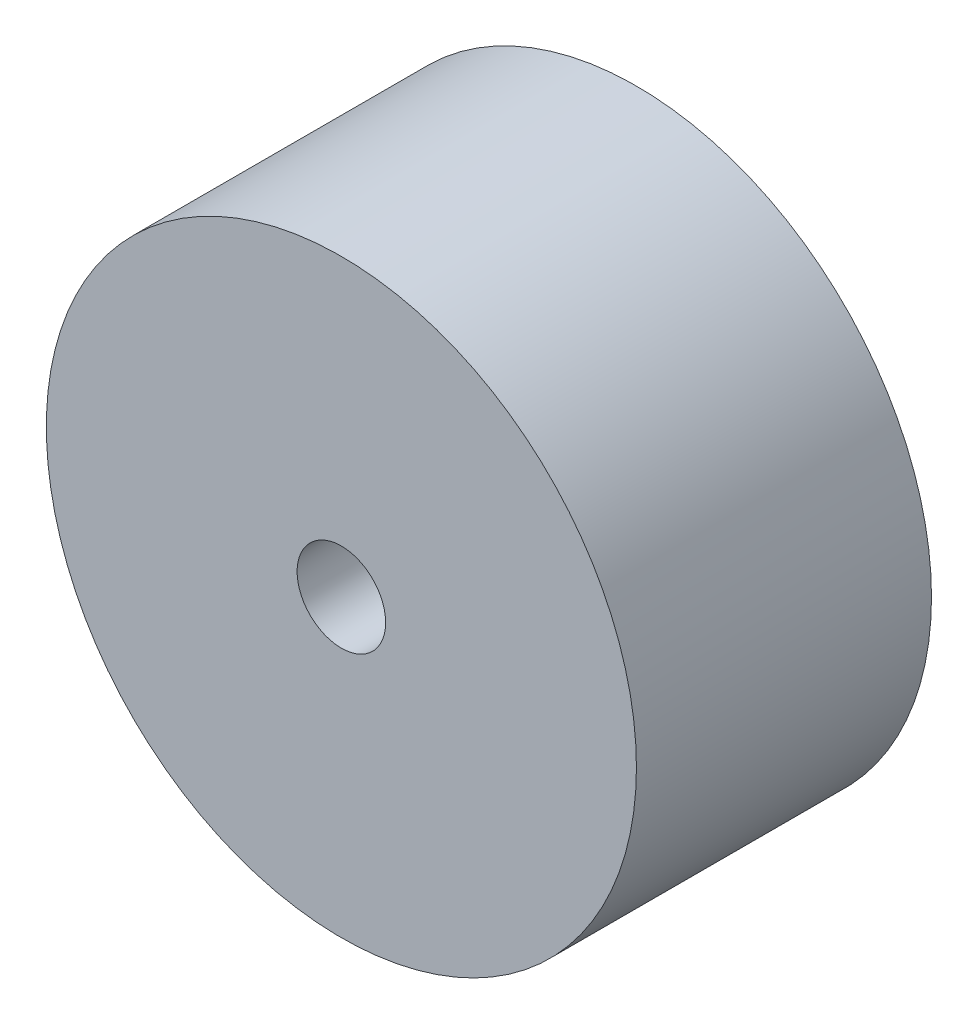
ISO-10303-21;
HEADER;
FILE_DESCRIPTION(('STEP AP214'),'2;1');
FILE_NAME('part.step','',(''),(''),'','','');
FILE_SCHEMA(('AUTOMOTIVE_DESIGN { 1 0 10303 214 1 1 1 1 }'));
ENDSEC;
DATA;
#1=APPLICATION_CONTEXT('core data for automotive mechanical design processes');
#2=APPLICATION_PROTOCOL_DEFINITION('international standard','automotive_design',2000,#1);
#3=PRODUCT_CONTEXT('',#1,'mechanical');
#4=PRODUCT('Part','Part','',(#3));
#5=PRODUCT_RELATED_PRODUCT_CATEGORY('part','',(#4));
#6=PRODUCT_DEFINITION_FORMATION('','',#4);
#7=PRODUCT_DEFINITION_CONTEXT('part definition',#1,'design');
#8=PRODUCT_DEFINITION('design','',#6,#7);
#9=PRODUCT_DEFINITION_SHAPE('','',#8);
#10=(LENGTH_UNIT() NAMED_UNIT(*) SI_UNIT(.MILLI.,.METRE.));
#11=(NAMED_UNIT(*) PLANE_ANGLE_UNIT() SI_UNIT($,.RADIAN.));
#12=(NAMED_UNIT(*) SI_UNIT($,.STERADIAN.) SOLID_ANGLE_UNIT());
#13=UNCERTAINTY_MEASURE_WITH_UNIT(LENGTH_MEASURE(1.E-05),#10,'distance_accuracy_value','');
#14=(GEOMETRIC_REPRESENTATION_CONTEXT(3) GLOBAL_UNCERTAINTY_ASSIGNED_CONTEXT((#13)) GLOBAL_UNIT_ASSIGNED_CONTEXT((#10,
#11,#12)) REPRESENTATION_CONTEXT('',''));
#15=CARTESIAN_POINT('',(0.,0.,0.));
#16=DIRECTION('',(0.,0.,1.));
#17=DIRECTION('',(1.,0.,0.));
#18=AXIS2_PLACEMENT_3D('',#15,#16,#17);
#19=CARTESIAN_POINT('',(0.,0.,50.));
#20=DIRECTION('',(0.,0.,-1.));
#21=DIRECTION('',(-1.,0.,0.));
#22=AXIS2_PLACEMENT_3D('',#19,#20,#21);
#23=CYLINDRICAL_SURFACE('',#22,50.);
#24=CARTESIAN_POINT('',(0.,0.,50.));
#25=DIRECTION('',(0.,0.,1.));
#26=DIRECTION('',(1.,0.,0.));
#27=AXIS2_PLACEMENT_3D('',#24,#25,#26);
#28=CIRCLE('',#27,50.);
#29=CARTESIAN_POINT('',(50.,0.,50.));
#30=VERTEX_POINT('',#29);
#31=EDGE_CURVE('E10',#30,#30,#28,.T.);
#32=ORIENTED_EDGE('',*,*,#31,.F.);
#33=EDGE_LOOP('',(#32));
#34=FACE_BOUND('',#33,.T.);
#35=CARTESIAN_POINT('',(0.,0.,0.));
#36=DIRECTION('',(0.,0.,1.));
#37=DIRECTION('',(1.,0.,0.));
#38=AXIS2_PLACEMENT_3D('',#35,#36,#37);
#39=CIRCLE('',#38,50.);
#40=CARTESIAN_POINT('',(50.,0.,0.));
#41=VERTEX_POINT('',#40);
#42=EDGE_CURVE('E42',#41,#41,#39,.T.);
#43=ORIENTED_EDGE('',*,*,#42,.T.);
#44=EDGE_LOOP('',(#43));
#45=FACE_BOUND('',#44,.T.);
#46=ADVANCED_FACE('F39',(#34,#45),#23,.T.);
#47=CARTESIAN_POINT('',(0.,0.,50.));
#48=DIRECTION('',(0.,0.,1.));
#49=DIRECTION('',(1.,0.,0.));
#50=AXIS2_PLACEMENT_3D('',#47,#48,#49);
#51=PLANE('',#50);
#52=CARTESIAN_POINT('',(0.,0.,50.));
#53=DIRECTION('',(0.,0.,1.));
#54=DIRECTION('',(1.,0.,0.));
#55=AXIS2_PLACEMENT_3D('',#52,#53,#54);
#56=CIRCLE('',#55,7.5);
#57=CARTESIAN_POINT('',(7.5,0.,50.));
#58=VERTEX_POINT('',#57);
#59=EDGE_CURVE('E51',#58,#58,#56,.T.);
#60=ORIENTED_EDGE('',*,*,#59,.F.);
#61=EDGE_LOOP('',(#60));
#62=FACE_BOUND('',#61,.T.);
#63=ORIENTED_EDGE('',*,*,#31,.T.);
#64=EDGE_LOOP('',(#63));
#65=FACE_BOUND('',#64,.T.);
#66=ADVANCED_FACE('F66',(#62,#65),#51,.T.);
#67=CARTESIAN_POINT('',(0.,0.,0.));
#68=DIRECTION('',(0.,0.,1.));
#69=DIRECTION('',(1.,0.,0.));
#70=AXIS2_PLACEMENT_3D('',#67,#68,#69);
#71=PLANE('',#70);
#72=CARTESIAN_POINT('',(0.,0.,0.));
#73=DIRECTION('',(0.,0.,1.));
#74=DIRECTION('',(1.,0.,0.));
#75=AXIS2_PLACEMENT_3D('',#72,#73,#74);
#76=CIRCLE('',#75,7.5);
#77=CARTESIAN_POINT('',(7.5,0.,0.));
#78=VERTEX_POINT('',#77);
#79=EDGE_CURVE('E49',#78,#78,#76,.T.);
#80=ORIENTED_EDGE('',*,*,#79,.T.);
#81=EDGE_LOOP('',(#80));
#82=FACE_BOUND('',#81,.T.);
#83=ORIENTED_EDGE('',*,*,#42,.F.);
#84=EDGE_LOOP('',(#83));
#85=FACE_BOUND('',#84,.T.);
#86=ADVANCED_FACE('F57',(#82,#85),#71,.F.);
#87=CARTESIAN_POINT('',(0.,0.,0.));
#88=DIRECTION('',(0.,0.,1.));
#89=DIRECTION('',(1.,0.,0.));
#90=AXIS2_PLACEMENT_3D('',#87,#88,#89);
#91=CYLINDRICAL_SURFACE('',#90,7.5);
#92=ORIENTED_EDGE('',*,*,#79,.F.);
#93=EDGE_LOOP('',(#92));
#94=FACE_BOUND('',#93,.T.);
#95=ORIENTED_EDGE('',*,*,#59,.T.);
#96=EDGE_LOOP('',(#95));
#97=FACE_BOUND('',#96,.T.);
#98=ADVANCED_FACE('F60',(#94,#97),#91,.F.);
#99=CLOSED_SHELL('',(#46,#66,#86,#98));
#100=MANIFOLD_SOLID_BREP('B2',#99);
#101=ADVANCED_BREP_SHAPE_REPRESENTATION('',(#18,#100),#14);
#102=SHAPE_DEFINITION_REPRESENTATION(#9,#101);
ENDSEC;
END-ISO-10303-21;
